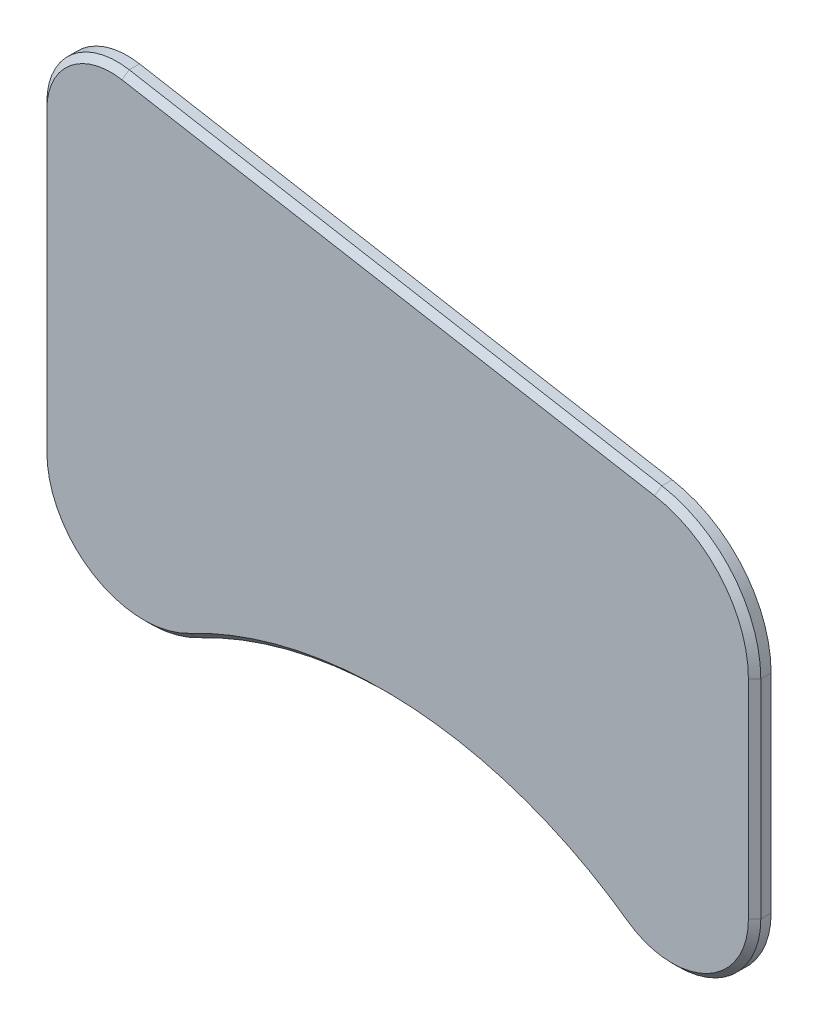
ISO-10303-21;
HEADER;
FILE_DESCRIPTION(('STEP AP214'),'2;1');
FILE_NAME('part.step','',(''),(''),'','','');
FILE_SCHEMA(('AUTOMOTIVE_DESIGN { 1 0 10303 214 1 1 1 1 }'));
ENDSEC;
DATA;
#1=APPLICATION_CONTEXT('core data for automotive mechanical design processes');
#2=APPLICATION_PROTOCOL_DEFINITION('international standard','automotive_design',2000,#1);
#3=PRODUCT_CONTEXT('',#1,'mechanical');
#4=PRODUCT('Part','Part','',(#3));
#5=PRODUCT_RELATED_PRODUCT_CATEGORY('part','',(#4));
#6=PRODUCT_DEFINITION_FORMATION('','',#4);
#7=PRODUCT_DEFINITION_CONTEXT('part definition',#1,'design');
#8=PRODUCT_DEFINITION('design','',#6,#7);
#9=PRODUCT_DEFINITION_SHAPE('','',#8);
#10=(LENGTH_UNIT() NAMED_UNIT(*) SI_UNIT(.MILLI.,.METRE.));
#11=(NAMED_UNIT(*) PLANE_ANGLE_UNIT() SI_UNIT($,.RADIAN.));
#12=(NAMED_UNIT(*) SI_UNIT($,.STERADIAN.) SOLID_ANGLE_UNIT());
#13=UNCERTAINTY_MEASURE_WITH_UNIT(LENGTH_MEASURE(1.E-05),#10,'distance_accuracy_value','');
#14=(GEOMETRIC_REPRESENTATION_CONTEXT(3) GLOBAL_UNCERTAINTY_ASSIGNED_CONTEXT((#13)) GLOBAL_UNIT_ASSIGNED_CONTEXT((#10,
#11,#12)) REPRESENTATION_CONTEXT('',''));
#15=CARTESIAN_POINT('',(0.,0.,0.));
#16=DIRECTION('',(0.,0.,1.));
#17=DIRECTION('',(1.,0.,0.));
#18=AXIS2_PLACEMENT_3D('',#15,#16,#17);
#19=CARTESIAN_POINT('',(-73.,26.0569889343465,4.));
#20=DIRECTION('',(0.,0.,-1.));
#21=DIRECTION('',(-1.,0.,0.));
#22=AXIS2_PLACEMENT_3D('',#19,#20,#21);
#23=CYLINDRICAL_SURFACE('',#22,17.);
#24=DIRECTION('',(0.,0.,-1.));
#25=VECTOR('',#24,1.);
#26=CARTESIAN_POINT('',(-90.,26.0569889343465,4.));
#27=LINE('',#26,#25);
#28=CARTESIAN_POINT('',(-90.,26.0569889343465,2.50000000000001));
#29=VERTEX_POINT('',#28);
#30=CARTESIAN_POINT('',(-90.,26.0569889343465,0.));
#31=VERTEX_POINT('',#30);
#32=EDGE_CURVE('E120',#29,#31,#27,.T.);
#33=ORIENTED_EDGE('',*,*,#32,.F.);
#34=CARTESIAN_POINT('',(-73.,26.0569889343465,2.50000000000001));
#35=DIRECTION('',(0.,0.,-1.));
#36=DIRECTION('',(-1.,0.,0.));
#37=AXIS2_PLACEMENT_3D('',#34,#35,#36);
#38=CIRCLE('',#37,17.);
#39=CARTESIAN_POINT('',(-70.0479809796623,42.798720735554,2.50000000000001));
#40=VERTEX_POINT('',#39);
#41=EDGE_CURVE('E11',#29,#40,#38,.T.);
#42=ORIENTED_EDGE('',*,*,#41,.T.);
#43=DIRECTION('',(0.,0.,-1.));
#44=VECTOR('',#43,1.);
#45=CARTESIAN_POINT('',(-70.0479809796623,42.798720735554,4.));
#46=LINE('',#45,#44);
#47=CARTESIAN_POINT('',(-70.0479809796623,42.798720735554,0.));
#48=VERTEX_POINT('',#47);
#49=EDGE_CURVE('E138',#40,#48,#46,.T.);
#50=ORIENTED_EDGE('',*,*,#49,.T.);
#51=CARTESIAN_POINT('',(-73.,26.0569889343465,0.));
#52=DIRECTION('',(0.,0.,1.));
#53=DIRECTION('',(-1.,0.,0.));
#54=AXIS2_PLACEMENT_3D('',#51,#52,#53);
#55=CIRCLE('',#54,17.);
#56=EDGE_CURVE('E133',#48,#31,#55,.T.);
#57=ORIENTED_EDGE('',*,*,#56,.T.);
#58=EDGE_LOOP('',(#33,#42,#50,#57));
#59=FACE_BOUND('',#58,.T.);
#60=ADVANCED_FACE('F33',(#59),#23,.T.);
#61=CARTESIAN_POINT('',(-90.,-45.9216569582568,4.));
#62=DIRECTION('',(1.,0.,0.));
#63=DIRECTION('',(0.,1.,0.));
#64=AXIS2_PLACEMENT_3D('',#61,#62,#63);
#65=PLANE('',#64);
#66=DIRECTION('',(0.,0.,-1.));
#67=VECTOR('',#66,1.);
#68=CARTESIAN_POINT('',(-90.,-45.9216569582568,4.));
#69=LINE('',#68,#67);
#70=CARTESIAN_POINT('',(-90.,-45.9216569582568,2.50000000000001));
#71=VERTEX_POINT('',#70);
#72=CARTESIAN_POINT('',(-90.,-45.9216569582568,0.));
#73=VERTEX_POINT('',#72);
#74=EDGE_CURVE('E127',#71,#73,#69,.T.);
#75=ORIENTED_EDGE('',*,*,#74,.F.);
#76=DIRECTION('',(0.,1.,0.));
#77=VECTOR('',#76,1.);
#78=CARTESIAN_POINT('',(-90.,-45.9216569582568,2.50000000000001));
#79=LINE('',#78,#77);
#80=EDGE_CURVE('E42',#71,#29,#79,.T.);
#81=ORIENTED_EDGE('',*,*,#80,.T.);
#82=ORIENTED_EDGE('',*,*,#32,.T.);
#83=DIRECTION('',(0.,-1.,0.));
#84=VECTOR('',#83,1.);
#85=CARTESIAN_POINT('',(-90.,-45.9216569582568,0.));
#86=LINE('',#85,#84);
#87=EDGE_CURVE('E123',#31,#73,#86,.T.);
#88=ORIENTED_EDGE('',*,*,#87,.T.);
#89=EDGE_LOOP('',(#75,#81,#82,#88));
#90=FACE_BOUND('',#89,.T.);
#91=ADVANCED_FACE('F122',(#90),#65,.F.);
#92=CARTESIAN_POINT('',(-65.,-45.9216569582568,4.));
#93=DIRECTION('',(0.,0.,-1.));
#94=DIRECTION('',(-1.,0.,0.));
#95=AXIS2_PLACEMENT_3D('',#92,#93,#94);
#96=CYLINDRICAL_SURFACE('',#95,25.);
#97=DIRECTION('',(0.,0.,-1.));
#98=VECTOR('',#97,1.);
#99=CARTESIAN_POINT('',(-53.3578826728636,-68.045424814144,4.));
#100=LINE('',#99,#98);
#101=CARTESIAN_POINT('',(-53.3578826728636,-68.045424814144,2.50000000000001));
#102=VERTEX_POINT('',#101);
#103=CARTESIAN_POINT('',(-53.3578826728636,-68.045424814144,0.));
#104=VERTEX_POINT('',#103);
#105=EDGE_CURVE('E168',#102,#104,#100,.T.);
#106=ORIENTED_EDGE('',*,*,#105,.F.);
#107=CARTESIAN_POINT('',(-65.,-45.9216569582568,2.50000000000001));
#108=DIRECTION('',(0.,0.,-1.));
#109=DIRECTION('',(-1.,0.,0.));
#110=AXIS2_PLACEMENT_3D('',#107,#108,#109);
#111=CIRCLE('',#110,25.);
#112=EDGE_CURVE('E196',#102,#71,#111,.T.);
#113=ORIENTED_EDGE('',*,*,#112,.T.);
#114=ORIENTED_EDGE('',*,*,#74,.T.);
#115=CARTESIAN_POINT('',(-65.,-45.9216569582568,0.));
#116=DIRECTION('',(0.,0.,1.));
#117=DIRECTION('',(1.,0.,0.));
#118=AXIS2_PLACEMENT_3D('',#115,#116,#117);
#119=CIRCLE('',#118,25.);
#120=EDGE_CURVE('E136',#73,#104,#119,.T.);
#121=ORIENTED_EDGE('',*,*,#120,.T.);
#122=EDGE_LOOP('',(#106,#113,#114,#121));
#123=FACE_BOUND('',#122,.T.);
#124=ADVANCED_FACE('F264',(#123),#96,.T.);
#125=CARTESIAN_POINT('',(-6.78941336431773,-156.540496237693,4.));
#126=DIRECTION('',(0.,0.,-1.));
#127=DIRECTION('',(-1.,0.,0.));
#128=AXIS2_PLACEMENT_3D('',#125,#126,#127);
#129=CYLINDRICAL_SURFACE('',#128,100.);
#130=DIRECTION('',(0.,0.,-1.));
#131=VECTOR('',#130,1.);
#132=CARTESIAN_POINT('',(51.368431105947,-75.1914635048295,4.));
#133=LINE('',#132,#131);
#134=CARTESIAN_POINT('',(51.368431105947,-75.1914635048295,2.50000000000001));
#135=VERTEX_POINT('',#134);
#136=CARTESIAN_POINT('',(51.368431105947,-75.1914635048295,0.));
#137=VERTEX_POINT('',#136);
#138=EDGE_CURVE('E166',#135,#137,#133,.T.);
#139=ORIENTED_EDGE('',*,*,#138,.F.);
#140=CARTESIAN_POINT('',(-6.78941336431773,-156.540496237693,2.50000000000001));
#141=DIRECTION('',(0.,0.,-1.));
#142=DIRECTION('',(-1.,0.,0.));
#143=AXIS2_PLACEMENT_3D('',#140,#141,#142);
#144=CIRCLE('',#143,100.);
#145=EDGE_CURVE('E192',#135,#102,#144,.F.);
#146=ORIENTED_EDGE('',*,*,#145,.T.);
#147=ORIENTED_EDGE('',*,*,#105,.T.);
#148=CARTESIAN_POINT('',(-6.78941336431773,-156.540496237693,0.));
#149=DIRECTION('',(0.,0.,-1.));
#150=DIRECTION('',(1.,0.,0.));
#151=AXIS2_PLACEMENT_3D('',#148,#149,#150);
#152=CIRCLE('',#151,100.);
#153=EDGE_CURVE('E145',#104,#137,#152,.T.);
#154=ORIENTED_EDGE('',*,*,#153,.T.);
#155=EDGE_LOOP('',(#139,#146,#147,#154));
#156=FACE_BOUND('',#155,.T.);
#157=ADVANCED_FACE('F261',(#156),#129,.F.);
#158=CARTESIAN_POINT('',(63.,-58.9216569582568,4.));
#159=DIRECTION('',(0.,0.,-1.));
#160=DIRECTION('',(-1.,0.,0.));
#161=AXIS2_PLACEMENT_3D('',#158,#159,#160);
#162=CYLINDRICAL_SURFACE('',#161,20.);
#163=DIRECTION('',(0.,0.,-1.));
#164=VECTOR('',#163,1.);
#165=CARTESIAN_POINT('',(83.,-58.9216569582568,4.));
#166=LINE('',#165,#164);
#167=CARTESIAN_POINT('',(83.,-58.9216569582568,2.50000000000001));
#168=VERTEX_POINT('',#167);
#169=CARTESIAN_POINT('',(83.,-58.9216569582568,0.));
#170=VERTEX_POINT('',#169);
#171=EDGE_CURVE('E164',#168,#170,#166,.T.);
#172=ORIENTED_EDGE('',*,*,#171,.F.);
#173=CARTESIAN_POINT('',(63.,-58.9216569582568,2.50000000000001));
#174=DIRECTION('',(0.,0.,-1.));
#175=DIRECTION('',(-1.,0.,0.));
#176=AXIS2_PLACEMENT_3D('',#173,#174,#175);
#177=CIRCLE('',#176,20.);
#178=EDGE_CURVE('E187',#168,#135,#177,.T.);
#179=ORIENTED_EDGE('',*,*,#178,.T.);
#180=ORIENTED_EDGE('',*,*,#138,.T.);
#181=CARTESIAN_POINT('',(63.,-58.9216569582568,0.));
#182=DIRECTION('',(0.,0.,1.));
#183=DIRECTION('',(-1.,0.,0.));
#184=AXIS2_PLACEMENT_3D('',#181,#182,#183);
#185=CIRCLE('',#184,20.);
#186=EDGE_CURVE('E148',#137,#170,#185,.T.);
#187=ORIENTED_EDGE('',*,*,#186,.T.);
#188=EDGE_LOOP('',(#172,#179,#180,#187));
#189=FACE_BOUND('',#188,.T.);
#190=ADVANCED_FACE('F246',(#189),#162,.T.);
#191=CARTESIAN_POINT('',(83.,-8.52165695825678,4.));
#192=DIRECTION('',(-1.,0.,0.));
#193=DIRECTION('',(0.,-1.,0.));
#194=AXIS2_PLACEMENT_3D('',#191,#192,#193);
#195=PLANE('',#194);
#196=DIRECTION('',(0.,0.,-1.));
#197=VECTOR('',#196,1.);
#198=CARTESIAN_POINT('',(83.,-8.52165695825678,4.));
#199=LINE('',#198,#197);
#200=CARTESIAN_POINT('',(83.,-8.52165695825678,2.50000000000001));
#201=VERTEX_POINT('',#200);
#202=CARTESIAN_POINT('',(83.,-8.52165695825678,0.));
#203=VERTEX_POINT('',#202);
#204=EDGE_CURVE('E162',#201,#203,#199,.T.);
#205=ORIENTED_EDGE('',*,*,#204,.F.);
#206=DIRECTION('',(0.,-1.,0.));
#207=VECTOR('',#206,1.);
#208=CARTESIAN_POINT('',(83.,-8.52165695825678,2.50000000000001));
#209=LINE('',#208,#207);
#210=EDGE_CURVE('E190',#201,#168,#209,.T.);
#211=ORIENTED_EDGE('',*,*,#210,.T.);
#212=ORIENTED_EDGE('',*,*,#171,.T.);
#213=DIRECTION('',(0.,1.,0.));
#214=VECTOR('',#213,1.);
#215=CARTESIAN_POINT('',(83.,-8.52165695825678,0.));
#216=LINE('',#215,#214);
#217=EDGE_CURVE('E151',#170,#203,#216,.T.);
#218=ORIENTED_EDGE('',*,*,#217,.T.);
#219=EDGE_LOOP('',(#205,#211,#212,#218));
#220=FACE_BOUND('',#219,.T.);
#221=ADVANCED_FACE('F243',(#220),#195,.F.);
#222=CARTESIAN_POINT('',(54.,-8.52165695825679,4.));
#223=DIRECTION('',(0.,0.,-1.));
#224=DIRECTION('',(-1.,0.,0.));
#225=AXIS2_PLACEMENT_3D('',#222,#223,#224);
#226=CYLINDRICAL_SURFACE('',#225,29.);
#227=DIRECTION('',(0.,0.,-1.));
#228=VECTOR('',#227,1.);
#229=CARTESIAN_POINT('',(59.0357971523408,20.0377678790973,4.));
#230=LINE('',#229,#228);
#231=CARTESIAN_POINT('',(59.0357971523408,20.0377678790973,2.5));
#232=VERTEX_POINT('',#231);
#233=CARTESIAN_POINT('',(59.0357971523408,20.0377678790973,0.));
#234=VERTEX_POINT('',#233);
#235=EDGE_CURVE('E160',#232,#234,#230,.T.);
#236=ORIENTED_EDGE('',*,*,#235,.F.);
#237=CARTESIAN_POINT('',(54.,-8.52165695825679,2.50000000000001));
#238=DIRECTION('',(0.,0.,-1.));
#239=DIRECTION('',(-1.,0.,0.));
#240=AXIS2_PLACEMENT_3D('',#237,#238,#239);
#241=CIRCLE('',#240,29.);
#242=EDGE_CURVE('E194',#232,#201,#241,.T.);
#243=ORIENTED_EDGE('',*,*,#242,.T.);
#244=ORIENTED_EDGE('',*,*,#204,.T.);
#245=CARTESIAN_POINT('',(54.,-8.52165695825679,0.));
#246=DIRECTION('',(0.,0.,1.));
#247=DIRECTION('',(1.,0.,0.));
#248=AXIS2_PLACEMENT_3D('',#245,#246,#247);
#249=CIRCLE('',#248,29.);
#250=EDGE_CURVE('E154',#203,#234,#249,.T.);
#251=ORIENTED_EDGE('',*,*,#250,.T.);
#252=EDGE_LOOP('',(#236,#243,#244,#251));
#253=FACE_BOUND('',#252,.T.);
#254=ADVANCED_FACE('F359',(#253),#226,.T.);
#255=CARTESIAN_POINT('',(-70.0479809796623,42.798720735554,4.));
#256=DIRECTION('',(-0.173648177666925,-0.984807753012209,0.));
#257=DIRECTION('',(0.984807753012209,-0.173648177666925,0.));
#258=AXIS2_PLACEMENT_3D('',#255,#256,#257);
#259=PLANE('',#258);
#260=ORIENTED_EDGE('',*,*,#49,.F.);
#261=DIRECTION('',(0.984807753012209,-0.173648177666925,0.));
#262=VECTOR('',#261,1.);
#263=CARTESIAN_POINT('',(-70.0479809796623,42.798720735554,2.5));
#264=LINE('',#263,#262);
#265=EDGE_CURVE('E198',#40,#232,#264,.T.);
#266=ORIENTED_EDGE('',*,*,#265,.T.);
#267=ORIENTED_EDGE('',*,*,#235,.T.);
#268=DIRECTION('',(-0.984807753012209,0.173648177666925,0.));
#269=VECTOR('',#268,1.);
#270=CARTESIAN_POINT('',(-70.0479809796623,42.798720735554,0.));
#271=LINE('',#270,#269);
#272=EDGE_CURVE('E157',#234,#48,#271,.T.);
#273=ORIENTED_EDGE('',*,*,#272,.T.);
#274=EDGE_LOOP('',(#260,#266,#267,#273));
#275=FACE_BOUND('',#274,.T.);
#276=ADVANCED_FACE('F351',(#275),#259,.F.);
#277=CARTESIAN_POINT('',(-73.,26.0569889343465,4.));
#278=DIRECTION('',(0.,0.,-1.));
#279=DIRECTION('',(-1.,0.,0.));
#280=AXIS2_PLACEMENT_3D('',#277,#278,#279);
#281=PLANE('',#280);
#282=CARTESIAN_POINT('',(-6.78941336431773,-156.540496237693,4.));
#283=DIRECTION('',(0.,0.,-1.));
#284=DIRECTION('',(-1.,0.,0.));
#285=AXIS2_PLACEMENT_3D('',#282,#283,#284);
#286=CIRCLE('',#285,101.5);
#287=CARTESIAN_POINT('',(-54.0564097124917,-66.7179987427908,4.));
#288=VERTEX_POINT('',#287);
#289=CARTESIAN_POINT('',(52.240798773001,-73.9712280138365,4.));
#290=VERTEX_POINT('',#289);
#291=EDGE_CURVE('E180',#288,#290,#286,.T.);
#292=ORIENTED_EDGE('',*,*,#291,.T.);
#293=CARTESIAN_POINT('',(63.,-58.9216569582568,4.));
#294=DIRECTION('',(0.,0.,-1.));
#295=DIRECTION('',(-1.,0.,0.));
#296=AXIS2_PLACEMENT_3D('',#293,#294,#295);
#297=CIRCLE('',#296,18.5);
#298=CARTESIAN_POINT('',(81.5,-58.9216569582568,4.));
#299=VERTEX_POINT('',#298);
#300=EDGE_CURVE('E184',#290,#299,#297,.F.);
#301=ORIENTED_EDGE('',*,*,#300,.T.);
#302=DIRECTION('',(0.,1.,0.));
#303=VECTOR('',#302,1.);
#304=CARTESIAN_POINT('',(81.5,26.0569889343465,4.));
#305=LINE('',#304,#303);
#306=CARTESIAN_POINT('',(81.5,-8.52165695825678,4.));
#307=VERTEX_POINT('',#306);
#308=EDGE_CURVE('E182',#299,#307,#305,.T.);
#309=ORIENTED_EDGE('',*,*,#308,.T.);
#310=CARTESIAN_POINT('',(54.,-8.52165695825679,4.));
#311=DIRECTION('',(0.,0.,-1.));
#312=DIRECTION('',(-1.,0.,0.));
#313=AXIS2_PLACEMENT_3D('',#310,#311,#312);
#314=CIRCLE('',#313,27.5);
#315=CARTESIAN_POINT('',(58.7753248858404,18.560556249579,4.));
#316=VERTEX_POINT('',#315);
#317=EDGE_CURVE('E178',#307,#316,#314,.F.);
#318=ORIENTED_EDGE('',*,*,#317,.T.);
#319=DIRECTION('',(-0.984807753012209,0.173648177666925,0.));
#320=VECTOR('',#319,1.);
#321=CARTESIAN_POINT('',(-70.3084532461627,41.3215091060357,4.));
#322=LINE('',#321,#320);
#323=CARTESIAN_POINT('',(-70.3084532461627,41.3215091060357,4.));
#324=VERTEX_POINT('',#323);
#325=EDGE_CURVE('E174',#316,#324,#322,.T.);
#326=ORIENTED_EDGE('',*,*,#325,.T.);
#327=CARTESIAN_POINT('',(-73.,26.0569889343465,4.));
#328=DIRECTION('',(0.,0.,-1.));
#329=DIRECTION('',(-1.,0.,0.));
#330=AXIS2_PLACEMENT_3D('',#327,#328,#329);
#331=CIRCLE('',#330,15.5);
#332=CARTESIAN_POINT('',(-88.5,26.0569889343465,4.));
#333=VERTEX_POINT('',#332);
#334=EDGE_CURVE('E126',#324,#333,#331,.F.);
#335=ORIENTED_EDGE('',*,*,#334,.T.);
#336=DIRECTION('',(0.,-1.,0.));
#337=VECTOR('',#336,1.);
#338=CARTESIAN_POINT('',(-88.5,26.0569889343465,4.));
#339=LINE('',#338,#337);
#340=CARTESIAN_POINT('',(-88.5,-45.9216569582568,4.));
#341=VERTEX_POINT('',#340);
#342=EDGE_CURVE('E172',#333,#341,#339,.T.);
#343=ORIENTED_EDGE('',*,*,#342,.T.);
#344=CARTESIAN_POINT('',(-65.,-45.9216569582568,4.));
#345=DIRECTION('',(0.,0.,-1.));
#346=DIRECTION('',(-1.,0.,0.));
#347=AXIS2_PLACEMENT_3D('',#344,#345,#346);
#348=CIRCLE('',#347,23.5);
#349=EDGE_CURVE('E176',#341,#288,#348,.F.);
#350=ORIENTED_EDGE('',*,*,#349,.T.);
#351=EDGE_LOOP('',(#292,#301,#309,#318,#326,#335,#343,#350));
#352=FACE_BOUND('',#351,.T.);
#353=ADVANCED_FACE('F228',(#352),#281,.F.);
#354=CARTESIAN_POINT('',(-73.,26.0569889343465,0.));
#355=DIRECTION('',(0.,0.,-1.));
#356=DIRECTION('',(-1.,0.,0.));
#357=AXIS2_PLACEMENT_3D('',#354,#355,#356);
#358=PLANE('',#357);
#359=ORIENTED_EDGE('',*,*,#56,.F.);
#360=ORIENTED_EDGE('',*,*,#272,.F.);
#361=ORIENTED_EDGE('',*,*,#250,.F.);
#362=ORIENTED_EDGE('',*,*,#217,.F.);
#363=ORIENTED_EDGE('',*,*,#186,.F.);
#364=ORIENTED_EDGE('',*,*,#153,.F.);
#365=ORIENTED_EDGE('',*,*,#120,.F.);
#366=ORIENTED_EDGE('',*,*,#87,.F.);
#367=EDGE_LOOP('',(#359,#360,#361,#362,#363,#364,#365,#366));
#368=FACE_BOUND('',#367,.T.);
#369=ADVANCED_FACE('F131',(#368),#358,.T.);
#370=CARTESIAN_POINT('',(-73.,26.0569889343465,4.));
#371=DIRECTION('',(0.,0.,-1.));
#372=DIRECTION('',(-1.,0.,0.));
#373=AXIS2_PLACEMENT_3D('',#370,#371,#372);
#374=CONICAL_SURFACE('',#373,15.5,0.785398163397448);
#375=DIRECTION('',(-0.12278780396897,-0.696364240320019,0.707106781186548));
#376=VECTOR('',#375,1.);
#377=CARTESIAN_POINT('',(-70.0479809796623,42.798720735554,2.50000000000001));
#378=LINE('',#377,#376);
#379=EDGE_CURVE('E142',#40,#324,#378,.T.);
#380=ORIENTED_EDGE('',*,*,#379,.F.);
#381=ORIENTED_EDGE('',*,*,#41,.F.);
#382=DIRECTION('',(-0.707106781186546,0.,-0.707106781186549));
#383=VECTOR('',#382,1.);
#384=CARTESIAN_POINT('',(-88.5,26.0569889343465,4.));
#385=LINE('',#384,#383);
#386=EDGE_CURVE('E37',#333,#29,#385,.T.);
#387=ORIENTED_EDGE('',*,*,#386,.F.);
#388=ORIENTED_EDGE('',*,*,#334,.F.);
#389=EDGE_LOOP('',(#380,#381,#387,#388));
#390=FACE_BOUND('',#389,.T.);
#391=ADVANCED_FACE('F35',(#390),#374,.T.);
#392=CARTESIAN_POINT('',(-88.5,26.0569889343465,4.));
#393=DIRECTION('',(0.707106781186549,0.,-0.707106781186546));
#394=DIRECTION('',(0.,-1.,0.));
#395=AXIS2_PLACEMENT_3D('',#392,#393,#394);
#396=PLANE('',#395);
#397=ORIENTED_EDGE('',*,*,#386,.T.);
#398=ORIENTED_EDGE('',*,*,#80,.F.);
#399=DIRECTION('',(-0.707106781186546,0.,-0.707106781186549));
#400=VECTOR('',#399,1.);
#401=CARTESIAN_POINT('',(-88.5,-45.9216569582568,4.));
#402=LINE('',#401,#400);
#403=EDGE_CURVE('E214',#341,#71,#402,.T.);
#404=ORIENTED_EDGE('',*,*,#403,.F.);
#405=ORIENTED_EDGE('',*,*,#342,.F.);
#406=EDGE_LOOP('',(#397,#398,#404,#405));
#407=FACE_BOUND('',#406,.T.);
#408=ADVANCED_FACE('F269',(#407),#396,.F.);
#409=CARTESIAN_POINT('',(-70.3084532461627,41.3215091060357,4.));
#410=DIRECTION('',(-0.122787803968969,-0.696364240320021,-0.707106781186546));
#411=DIRECTION('',(-0.984807753012209,0.173648177666925,0.));
#412=AXIS2_PLACEMENT_3D('',#409,#410,#411);
#413=PLANE('',#412);
#414=ORIENTED_EDGE('',*,*,#379,.T.);
#415=ORIENTED_EDGE('',*,*,#325,.F.);
#416=DIRECTION('',(-0.12278780396897,-0.696364240320018,0.707106781186549));
#417=VECTOR('',#416,1.);
#418=CARTESIAN_POINT('',(59.0357971523408,20.0377678790973,2.5));
#419=LINE('',#418,#417);
#420=EDGE_CURVE('E211',#232,#316,#419,.T.);
#421=ORIENTED_EDGE('',*,*,#420,.F.);
#422=ORIENTED_EDGE('',*,*,#265,.F.);
#423=EDGE_LOOP('',(#414,#415,#421,#422));
#424=FACE_BOUND('',#423,.T.);
#425=ADVANCED_FACE('F221',(#424),#413,.F.);
#426=CARTESIAN_POINT('',(-65.,-45.9216569582568,4.));
#427=DIRECTION('',(0.,0.,-1.));
#428=DIRECTION('',(-1.,0.,0.));
#429=AXIS2_PLACEMENT_3D('',#426,#427,#428);
#430=CONICAL_SURFACE('',#429,23.5,0.785398163397448);
#431=ORIENTED_EDGE('',*,*,#403,.T.);
#432=ORIENTED_EDGE('',*,*,#112,.F.);
#433=DIRECTION('',(0.329288804375502,-0.625754651051791,-0.70710678118655));
#434=VECTOR('',#433,1.);
#435=CARTESIAN_POINT('',(-54.0564097124917,-66.7179987427908,4.));
#436=LINE('',#435,#434);
#437=EDGE_CURVE('E208',#288,#102,#436,.T.);
#438=ORIENTED_EDGE('',*,*,#437,.F.);
#439=ORIENTED_EDGE('',*,*,#349,.F.);
#440=EDGE_LOOP('',(#431,#432,#438,#439));
#441=FACE_BOUND('',#440,.T.);
#442=ADVANCED_FACE('F266',(#441),#430,.T.);
#443=CARTESIAN_POINT('',(54.,-8.52165695825679,4.));
#444=DIRECTION('',(0.,0.,-1.));
#445=DIRECTION('',(-1.,0.,0.));
#446=AXIS2_PLACEMENT_3D('',#443,#444,#445);
#447=CONICAL_SURFACE('',#446,27.5,0.785398163397446);
#448=ORIENTED_EDGE('',*,*,#420,.T.);
#449=ORIENTED_EDGE('',*,*,#317,.F.);
#450=DIRECTION('',(-0.707106781186546,0.,0.707106781186549));
#451=VECTOR('',#450,1.);
#452=CARTESIAN_POINT('',(83.,-8.52165695825678,2.50000000000001));
#453=LINE('',#452,#451);
#454=EDGE_CURVE('E205',#201,#307,#453,.T.);
#455=ORIENTED_EDGE('',*,*,#454,.F.);
#456=ORIENTED_EDGE('',*,*,#242,.F.);
#457=EDGE_LOOP('',(#448,#449,#455,#456));
#458=FACE_BOUND('',#457,.T.);
#459=ADVANCED_FACE('F234',(#458),#447,.T.);
#460=CARTESIAN_POINT('',(-6.78941336431773,-156.540496237693,4.));
#461=DIRECTION('',(0.,0.,1.));
#462=DIRECTION('',(1.,0.,0.));
#463=AXIS2_PLACEMENT_3D('',#460,#461,#462);
#464=CONICAL_SURFACE('',#463,101.5,0.785398163397451);
#465=ORIENTED_EDGE('',*,*,#437,.T.);
#466=ORIENTED_EDGE('',*,*,#145,.F.);
#467=DIRECTION('',(-0.411238062041169,-0.575224526883744,-0.707106781186545));
#468=VECTOR('',#467,1.);
#469=CARTESIAN_POINT('',(52.240798773001,-73.9712280138365,4.));
#470=LINE('',#469,#468);
#471=EDGE_CURVE('E203',#290,#135,#470,.T.);
#472=ORIENTED_EDGE('',*,*,#471,.F.);
#473=ORIENTED_EDGE('',*,*,#291,.F.);
#474=EDGE_LOOP('',(#465,#466,#472,#473));
#475=FACE_BOUND('',#474,.T.);
#476=ADVANCED_FACE('F257',(#475),#464,.F.);
#477=CARTESIAN_POINT('',(81.5,26.0569889343465,4.));
#478=DIRECTION('',(-0.707106781186551,0.,-0.707106781186544));
#479=DIRECTION('',(0.,1.,0.));
#480=AXIS2_PLACEMENT_3D('',#477,#478,#479);
#481=PLANE('',#480);
#482=ORIENTED_EDGE('',*,*,#454,.T.);
#483=ORIENTED_EDGE('',*,*,#308,.F.);
#484=DIRECTION('',(-0.707106781186543,0.,0.707106781186552));
#485=VECTOR('',#484,1.);
#486=CARTESIAN_POINT('',(83.,-58.9216569582568,2.50000000000001));
#487=LINE('',#486,#485);
#488=EDGE_CURVE('E201',#168,#299,#487,.T.);
#489=ORIENTED_EDGE('',*,*,#488,.F.);
#490=ORIENTED_EDGE('',*,*,#210,.F.);
#491=EDGE_LOOP('',(#482,#483,#489,#490));
#492=FACE_BOUND('',#491,.T.);
#493=ADVANCED_FACE('F238',(#492),#481,.F.);
#494=CARTESIAN_POINT('',(63.,-58.9216569582568,4.));
#495=DIRECTION('',(0.,0.,-1.));
#496=DIRECTION('',(-1.,0.,0.));
#497=AXIS2_PLACEMENT_3D('',#494,#495,#496);
#498=CONICAL_SURFACE('',#497,18.5,0.785398163397447);
#499=ORIENTED_EDGE('',*,*,#471,.T.);
#500=ORIENTED_EDGE('',*,*,#178,.F.);
#501=ORIENTED_EDGE('',*,*,#488,.T.);
#502=ORIENTED_EDGE('',*,*,#300,.F.);
#503=EDGE_LOOP('',(#499,#500,#501,#502));
#504=FACE_BOUND('',#503,.T.);
#505=ADVANCED_FACE('F251',(#504),#498,.T.);
#506=CLOSED_SHELL('',(#60,#91,#124,#157,#190,#221,#254,#276,#353,#369,#391,#408,#425,#442,#459,
#476,#493,#505));
#507=MANIFOLD_SOLID_BREP('B2',#506);
#508=ADVANCED_BREP_SHAPE_REPRESENTATION('',(#18,#507),#14);
#509=SHAPE_DEFINITION_REPRESENTATION(#9,#508);
ENDSEC;
END-ISO-10303-21;
